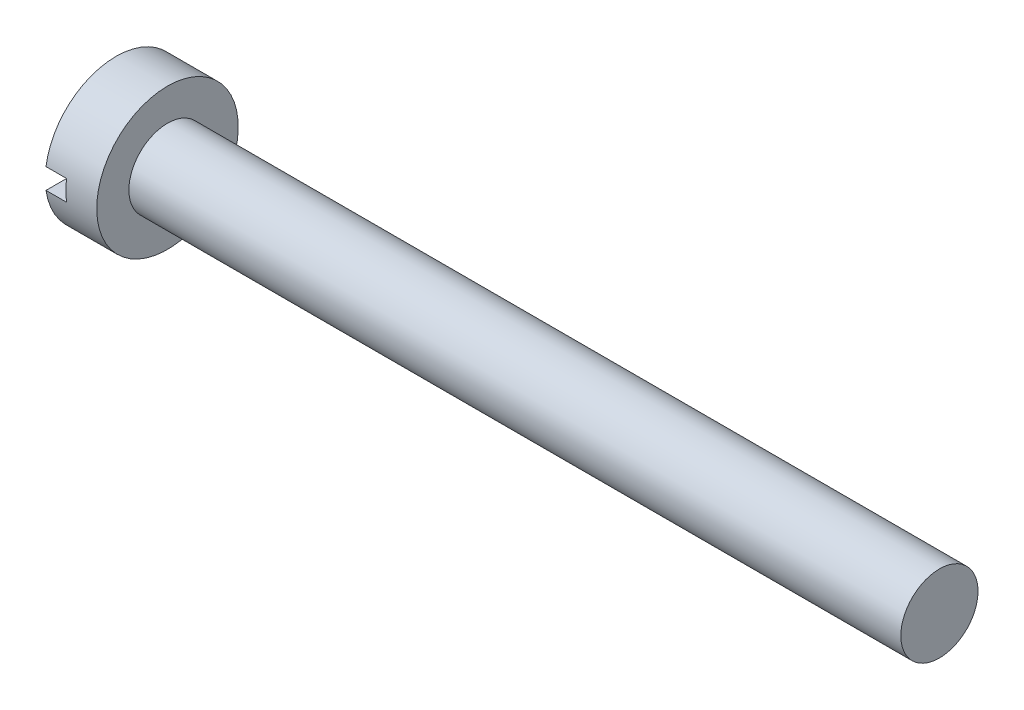
ISO-10303-21;
HEADER;
FILE_DESCRIPTION(('STEP AP214'),'2;1');
FILE_NAME('part.step','',(''),(''),'','','');
FILE_SCHEMA(('AUTOMOTIVE_DESIGN { 1 0 10303 214 1 1 1 1 }'));
ENDSEC;
DATA;
#1=APPLICATION_CONTEXT('core data for automotive mechanical design processes');
#2=APPLICATION_PROTOCOL_DEFINITION('international standard','automotive_design',2000,#1);
#3=PRODUCT_CONTEXT('',#1,'mechanical');
#4=PRODUCT('Part','Part','',(#3));
#5=PRODUCT_RELATED_PRODUCT_CATEGORY('part','',(#4));
#6=PRODUCT_DEFINITION_FORMATION('','',#4);
#7=PRODUCT_DEFINITION_CONTEXT('part definition',#1,'design');
#8=PRODUCT_DEFINITION('design','',#6,#7);
#9=PRODUCT_DEFINITION_SHAPE('','',#8);
#10=(LENGTH_UNIT() NAMED_UNIT(*) SI_UNIT(.MILLI.,.METRE.));
#11=(NAMED_UNIT(*) PLANE_ANGLE_UNIT() SI_UNIT($,.RADIAN.));
#12=(NAMED_UNIT(*) SI_UNIT($,.STERADIAN.) SOLID_ANGLE_UNIT());
#13=UNCERTAINTY_MEASURE_WITH_UNIT(LENGTH_MEASURE(1.E-05),#10,'distance_accuracy_value','');
#14=(GEOMETRIC_REPRESENTATION_CONTEXT(3) GLOBAL_UNCERTAINTY_ASSIGNED_CONTEXT((#13)) GLOBAL_UNIT_ASSIGNED_CONTEXT((#10,
#11,#12)) REPRESENTATION_CONTEXT('',''));
#15=CARTESIAN_POINT('',(0.,0.,0.));
#16=DIRECTION('',(0.,0.,1.));
#17=DIRECTION('',(1.,0.,0.));
#18=AXIS2_PLACEMENT_3D('',#15,#16,#17);
#19=CARTESIAN_POINT('',(0.,0.,0.));
#20=DIRECTION('',(-1.,0.,0.));
#21=DIRECTION('',(0.,-1.,0.));
#22=AXIS2_PLACEMENT_3D('',#19,#20,#21);
#23=PLANE('',#22);
#24=DIRECTION('',(0.,0.,-1.));
#25=VECTOR('',#24,1.);
#26=CARTESIAN_POINT('',(0.,0.399999999999997,-2.75));
#27=LINE('',#26,#25);
#28=CARTESIAN_POINT('',(0.,0.399999999999999,2.72075357208256));
#29=VERTEX_POINT('',#28);
#30=CARTESIAN_POINT('',(0.,0.399999999999997,-2.72075357208256));
#31=VERTEX_POINT('',#30);
#32=EDGE_CURVE('E83',#29,#31,#27,.T.);
#33=ORIENTED_EDGE('',*,*,#32,.F.);
#34=CARTESIAN_POINT('',(0.,0.,0.));
#35=DIRECTION('',(1.,0.,0.));
#36=DIRECTION('',(0.,1.,0.));
#37=AXIS2_PLACEMENT_3D('',#34,#35,#36);
#38=CIRCLE('',#37,2.75);
#39=EDGE_CURVE('E89',#31,#29,#38,.T.);
#40=ORIENTED_EDGE('',*,*,#39,.F.);
#41=EDGE_LOOP('',(#33,#40));
#42=FACE_BOUND('',#41,.T.);
#43=ADVANCED_FACE('F33',(#42),#23,.T.);
#44=DIRECTION('',(0.,0.,1.));
#45=VECTOR('',#44,1.);
#46=CARTESIAN_POINT('',(0.,-0.400000000000001,-2.75));
#47=LINE('',#46,#45);
#48=CARTESIAN_POINT('',(0.,-0.400000000000001,-2.72075357208256));
#49=VERTEX_POINT('',#48);
#50=CARTESIAN_POINT('',(0.,-0.399999999999999,2.72075357208256));
#51=VERTEX_POINT('',#50);
#52=EDGE_CURVE('E77',#49,#51,#47,.T.);
#53=ORIENTED_EDGE('',*,*,#52,.F.);
#54=EDGE_CURVE('E82',#51,#49,#38,.T.);
#55=ORIENTED_EDGE('',*,*,#54,.F.);
#56=EDGE_LOOP('',(#53,#55));
#57=FACE_BOUND('',#56,.T.);
#58=ADVANCED_FACE('F35',(#57),#23,.T.);
#59=CARTESIAN_POINT('',(32.,0.,0.));
#60=DIRECTION('',(1.,0.,0.));
#61=DIRECTION('',(0.,1.,0.));
#62=AXIS2_PLACEMENT_3D('',#59,#60,#61);
#63=CYLINDRICAL_SURFACE('',#62,2.75);
#64=DIRECTION('',(1.,0.,0.));
#65=VECTOR('',#64,1.);
#66=CARTESIAN_POINT('',(32.,0.399999999999997,-2.72075357208256));
#67=LINE('',#66,#65);
#68=CARTESIAN_POINT('',(0.799999999999999,0.399999999999997,-2.72075357208256));
#69=VERTEX_POINT('',#68);
#70=EDGE_CURVE('E11',#31,#69,#67,.T.);
#71=ORIENTED_EDGE('',*,*,#70,.F.);
#72=ORIENTED_EDGE('',*,*,#39,.T.);
#73=DIRECTION('',(1.,0.,0.));
#74=VECTOR('',#73,1.);
#75=CARTESIAN_POINT('',(32.,0.399999999999999,2.72075357208256));
#76=LINE('',#75,#74);
#77=CARTESIAN_POINT('',(0.799999999999999,0.399999999999999,2.72075357208256));
#78=VERTEX_POINT('',#77);
#79=EDGE_CURVE('E98',#78,#29,#76,.F.);
#80=ORIENTED_EDGE('',*,*,#79,.F.);
#81=CARTESIAN_POINT('',(0.799999999999999,0.,0.));
#82=DIRECTION('',(-1.,0.,0.));
#83=DIRECTION('',(0.,0.,1.));
#84=AXIS2_PLACEMENT_3D('',#81,#82,#83);
#85=CIRCLE('',#84,2.75);
#86=CARTESIAN_POINT('',(0.799999999999999,-0.399999999999999,2.72075357208256));
#87=VERTEX_POINT('',#86);
#88=EDGE_CURVE('E48',#78,#87,#85,.F.);
#89=ORIENTED_EDGE('',*,*,#88,.T.);
#90=DIRECTION('',(1.,0.,0.));
#91=VECTOR('',#90,1.);
#92=CARTESIAN_POINT('',(32.,-0.399999999999999,2.72075357208256));
#93=LINE('',#92,#91);
#94=EDGE_CURVE('E88',#51,#87,#93,.T.);
#95=ORIENTED_EDGE('',*,*,#94,.F.);
#96=ORIENTED_EDGE('',*,*,#54,.T.);
#97=DIRECTION('',(1.,0.,0.));
#98=VECTOR('',#97,1.);
#99=CARTESIAN_POINT('',(32.,-0.400000000000001,-2.72075357208256));
#100=LINE('',#99,#98);
#101=CARTESIAN_POINT('',(0.799999999999999,-0.400000000000001,-2.72075357208256));
#102=VERTEX_POINT('',#101);
#103=EDGE_CURVE('E41',#102,#49,#100,.F.);
#104=ORIENTED_EDGE('',*,*,#103,.F.);
#105=EDGE_CURVE('E56',#102,#69,#85,.F.);
#106=ORIENTED_EDGE('',*,*,#105,.T.);
#107=EDGE_LOOP('',(#71,#72,#80,#89,#95,#96,#104,#106));
#108=FACE_BOUND('',#107,.T.);
#109=CARTESIAN_POINT('',(2.,0.,0.));
#110=DIRECTION('',(1.,0.,0.));
#111=DIRECTION('',(0.,1.,0.));
#112=AXIS2_PLACEMENT_3D('',#109,#110,#111);
#113=CIRCLE('',#112,2.75);
#114=CARTESIAN_POINT('',(2.,2.75,0.));
#115=VERTEX_POINT('',#114);
#116=EDGE_CURVE('E93',#115,#115,#113,.T.);
#117=ORIENTED_EDGE('',*,*,#116,.F.);
#118=EDGE_LOOP('',(#117));
#119=FACE_BOUND('',#118,.T.);
#120=ADVANCED_FACE('F86',(#108,#119),#63,.T.);
#121=CARTESIAN_POINT('',(2.,2.75,0.));
#122=DIRECTION('',(1.,0.,0.));
#123=DIRECTION('',(0.,1.,0.));
#124=AXIS2_PLACEMENT_3D('',#121,#122,#123);
#125=PLANE('',#124);
#126=ORIENTED_EDGE('',*,*,#116,.T.);
#127=EDGE_LOOP('',(#126));
#128=FACE_BOUND('',#127,.T.);
#129=CARTESIAN_POINT('',(2.,0.,0.));
#130=DIRECTION('',(1.,0.,0.));
#131=DIRECTION('',(0.,1.,0.));
#132=AXIS2_PLACEMENT_3D('',#129,#130,#131);
#133=CIRCLE('',#132,1.5);
#134=CARTESIAN_POINT('',(2.,1.5,0.));
#135=VERTEX_POINT('',#134);
#136=EDGE_CURVE('E111',#135,#135,#133,.T.);
#137=ORIENTED_EDGE('',*,*,#136,.F.);
#138=EDGE_LOOP('',(#137));
#139=FACE_BOUND('',#138,.T.);
#140=ADVANCED_FACE('F118',(#128,#139),#125,.T.);
#141=CARTESIAN_POINT('',(32.,0.,0.));
#142=DIRECTION('',(1.,0.,0.));
#143=DIRECTION('',(0.,1.,0.));
#144=AXIS2_PLACEMENT_3D('',#141,#142,#143);
#145=CYLINDRICAL_SURFACE('',#144,1.5);
#146=ORIENTED_EDGE('',*,*,#136,.T.);
#147=EDGE_LOOP('',(#146));
#148=FACE_BOUND('',#147,.T.);
#149=CARTESIAN_POINT('',(32.,0.,0.));
#150=DIRECTION('',(1.,0.,0.));
#151=DIRECTION('',(0.,1.,0.));
#152=AXIS2_PLACEMENT_3D('',#149,#150,#151);
#153=CIRCLE('',#152,1.49999999999999);
#154=CARTESIAN_POINT('',(32.,1.5,0.));
#155=VERTEX_POINT('',#154);
#156=EDGE_CURVE('E109',#155,#155,#153,.T.);
#157=ORIENTED_EDGE('',*,*,#156,.F.);
#158=EDGE_LOOP('',(#157));
#159=FACE_BOUND('',#158,.T.);
#160=ADVANCED_FACE('F125',(#148,#159),#145,.T.);
#161=CARTESIAN_POINT('',(32.,1.5,0.));
#162=DIRECTION('',(1.,0.,0.));
#163=DIRECTION('',(0.,1.,0.));
#164=AXIS2_PLACEMENT_3D('',#161,#162,#163);
#165=PLANE('',#164);
#166=ORIENTED_EDGE('',*,*,#156,.T.);
#167=EDGE_LOOP('',(#166));
#168=FACE_BOUND('',#167,.T.);
#169=ADVANCED_FACE('F150',(#168),#165,.T.);
#170=CARTESIAN_POINT('',(0.8,0.399999999999997,-2.75));
#171=DIRECTION('',(0.,1.,0.));
#172=DIRECTION('',(0.,0.,1.));
#173=AXIS2_PLACEMENT_3D('',#170,#171,#172);
#174=PLANE('',#173);
#175=ORIENTED_EDGE('',*,*,#79,.T.);
#176=ORIENTED_EDGE('',*,*,#32,.T.);
#177=ORIENTED_EDGE('',*,*,#70,.T.);
#178=DIRECTION('',(0.,0.,-1.));
#179=VECTOR('',#178,1.);
#180=CARTESIAN_POINT('',(0.8,0.399999999999997,-2.75));
#181=LINE('',#180,#179);
#182=EDGE_CURVE('E105',#78,#69,#181,.T.);
#183=ORIENTED_EDGE('',*,*,#182,.F.);
#184=EDGE_LOOP('',(#175,#176,#177,#183));
#185=FACE_BOUND('',#184,.T.);
#186=ADVANCED_FACE('F145',(#185),#174,.F.);
#187=CARTESIAN_POINT('',(0.8,-0.400000000000001,-2.75));
#188=DIRECTION('',(0.,-1.,0.));
#189=DIRECTION('',(0.,0.,-1.));
#190=AXIS2_PLACEMENT_3D('',#187,#188,#189);
#191=PLANE('',#190);
#192=ORIENTED_EDGE('',*,*,#103,.T.);
#193=ORIENTED_EDGE('',*,*,#52,.T.);
#194=ORIENTED_EDGE('',*,*,#94,.T.);
#195=DIRECTION('',(0.,0.,1.));
#196=VECTOR('',#195,1.);
#197=CARTESIAN_POINT('',(0.8,-0.400000000000001,-2.75));
#198=LINE('',#197,#196);
#199=EDGE_CURVE('E78',#102,#87,#198,.T.);
#200=ORIENTED_EDGE('',*,*,#199,.F.);
#201=EDGE_LOOP('',(#192,#193,#194,#200));
#202=FACE_BOUND('',#201,.T.);
#203=ADVANCED_FACE('F76',(#202),#191,.F.);
#204=CARTESIAN_POINT('',(0.8,0.,0.));
#205=DIRECTION('',(-1.,0.,0.));
#206=DIRECTION('',(0.,0.,1.));
#207=AXIS2_PLACEMENT_3D('',#204,#205,#206);
#208=PLANE('',#207);
#209=ORIENTED_EDGE('',*,*,#199,.T.);
#210=ORIENTED_EDGE('',*,*,#88,.F.);
#211=ORIENTED_EDGE('',*,*,#182,.T.);
#212=ORIENTED_EDGE('',*,*,#105,.F.);
#213=EDGE_LOOP('',(#209,#210,#211,#212));
#214=FACE_BOUND('',#213,.T.);
#215=ADVANCED_FACE('F160',(#214),#208,.T.);
#216=CLOSED_SHELL('',(#43,#58,#120,#140,#160,#169,#186,#203,#215));
#217=MANIFOLD_SOLID_BREP('B2',#216);
#218=ADVANCED_BREP_SHAPE_REPRESENTATION('',(#18,#217),#14);
#219=SHAPE_DEFINITION_REPRESENTATION(#9,#218);
ENDSEC;
END-ISO-10303-21;
